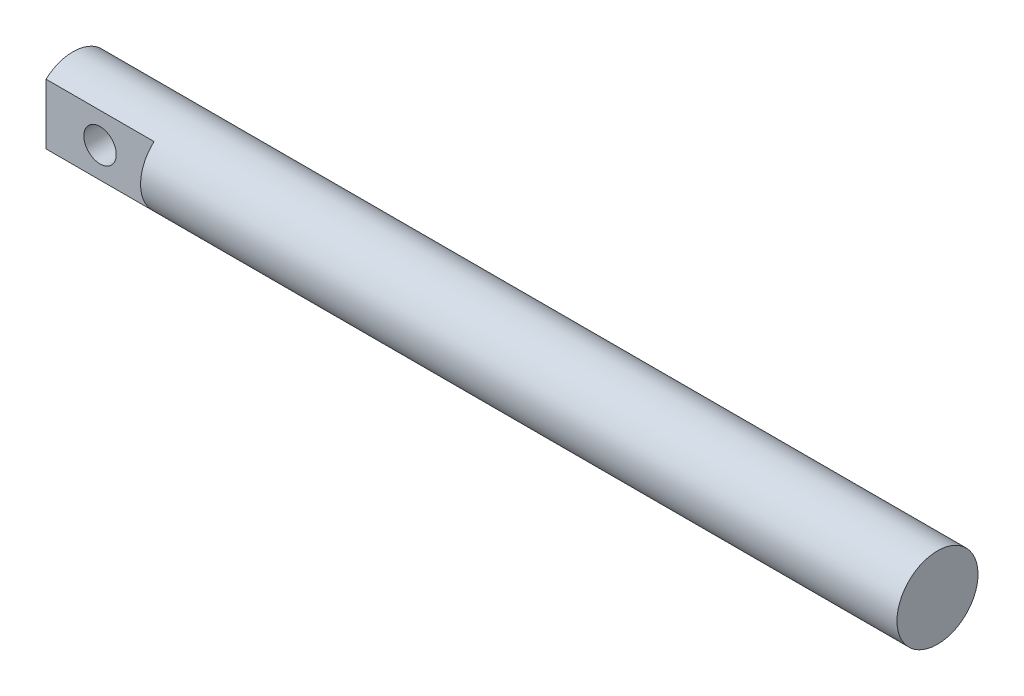
ISO-10303-21;
HEADER;
FILE_DESCRIPTION(('STEP AP214'),'2;1');
FILE_NAME('part.step','',(''),(''),'','','');
FILE_SCHEMA(('AUTOMOTIVE_DESIGN { 1 0 10303 214 1 1 1 1 }'));
ENDSEC;
DATA;
#1=APPLICATION_CONTEXT('core data for automotive mechanical design processes');
#2=APPLICATION_PROTOCOL_DEFINITION('international standard','automotive_design',2000,#1);
#3=PRODUCT_CONTEXT('',#1,'mechanical');
#4=PRODUCT('Part','Part','',(#3));
#5=PRODUCT_RELATED_PRODUCT_CATEGORY('part','',(#4));
#6=PRODUCT_DEFINITION_FORMATION('','',#4);
#7=PRODUCT_DEFINITION_CONTEXT('part definition',#1,'design');
#8=PRODUCT_DEFINITION('design','',#6,#7);
#9=PRODUCT_DEFINITION_SHAPE('','',#8);
#10=(LENGTH_UNIT() NAMED_UNIT(*) SI_UNIT(.MILLI.,.METRE.));
#11=(NAMED_UNIT(*) PLANE_ANGLE_UNIT() SI_UNIT($,.RADIAN.));
#12=(NAMED_UNIT(*) SI_UNIT($,.STERADIAN.) SOLID_ANGLE_UNIT());
#13=UNCERTAINTY_MEASURE_WITH_UNIT(LENGTH_MEASURE(1.E-05),#10,'distance_accuracy_value','');
#14=(GEOMETRIC_REPRESENTATION_CONTEXT(3) GLOBAL_UNCERTAINTY_ASSIGNED_CONTEXT((#13)) GLOBAL_UNIT_ASSIGNED_CONTEXT((#10,
#11,#12)) REPRESENTATION_CONTEXT('',''));
#15=CARTESIAN_POINT('',(0.,0.,0.));
#16=DIRECTION('',(0.,0.,1.));
#17=DIRECTION('',(1.,0.,0.));
#18=AXIS2_PLACEMENT_3D('',#15,#16,#17);
#19=CARTESIAN_POINT('',(-101.6,0.,0.));
#20=DIRECTION('',(1.,0.,0.));
#21=DIRECTION('',(0.,0.,-1.));
#22=AXIS2_PLACEMENT_3D('',#19,#20,#21);
#23=CYLINDRICAL_SURFACE('',#22,4.7625);
#24=CARTESIAN_POINT('',(0.,0.,0.));
#25=DIRECTION('',(-1.,0.,0.));
#26=DIRECTION('',(0.,0.,1.));
#27=AXIS2_PLACEMENT_3D('',#24,#25,#26);
#28=CIRCLE('',#27,4.7625);
#29=CARTESIAN_POINT('',(0.,0.,4.7625));
#30=VERTEX_POINT('',#29);
#31=EDGE_CURVE('E104',#30,#30,#28,.T.);
#32=ORIENTED_EDGE('',*,*,#31,.T.);
#33=EDGE_LOOP('',(#32));
#34=FACE_BOUND('',#33,.T.);
#35=DIRECTION('',(1.,0.,0.));
#36=VECTOR('',#35,1.);
#37=CARTESIAN_POINT('',(-101.6,3.54975791428092,-3.17499999999999));
#38=LINE('',#37,#36);
#39=CARTESIAN_POINT('',(-101.6,3.54975791428092,-3.17499999999999));
#40=VERTEX_POINT('',#39);
#41=CARTESIAN_POINT('',(-88.9,3.54975791428092,-3.17499999999999));
#42=VERTEX_POINT('',#41);
#43=EDGE_CURVE('E109',#40,#42,#38,.T.);
#44=ORIENTED_EDGE('',*,*,#43,.F.);
#45=CARTESIAN_POINT('',(-101.6,0.,0.));
#46=DIRECTION('',(-1.,0.,0.));
#47=DIRECTION('',(0.,0.,1.));
#48=AXIS2_PLACEMENT_3D('',#45,#46,#47);
#49=CIRCLE('',#48,4.7625);
#50=CARTESIAN_POINT('',(-101.6,3.54975791428091,3.17500000000001));
#51=VERTEX_POINT('',#50);
#52=EDGE_CURVE('E103',#51,#40,#49,.T.);
#53=ORIENTED_EDGE('',*,*,#52,.F.);
#54=DIRECTION('',(1.,0.,0.));
#55=VECTOR('',#54,1.);
#56=CARTESIAN_POINT('',(-101.6,3.54975791428091,3.17500000000001));
#57=LINE('',#56,#55);
#58=CARTESIAN_POINT('',(-88.9,3.54975791428091,3.17500000000001));
#59=VERTEX_POINT('',#58);
#60=EDGE_CURVE('E64',#59,#51,#57,.F.);
#61=ORIENTED_EDGE('',*,*,#60,.F.);
#62=CARTESIAN_POINT('',(-88.9,0.,0.));
#63=DIRECTION('',(1.,0.,0.));
#64=DIRECTION('',(0.,0.,-1.));
#65=AXIS2_PLACEMENT_3D('',#62,#63,#64);
#66=CIRCLE('',#65,4.7625);
#67=CARTESIAN_POINT('',(-88.9,-3.54975791428091,3.17500000000001));
#68=VERTEX_POINT('',#67);
#69=EDGE_CURVE('E49',#59,#68,#66,.T.);
#70=ORIENTED_EDGE('',*,*,#69,.T.);
#71=DIRECTION('',(1.,0.,0.));
#72=VECTOR('',#71,1.);
#73=CARTESIAN_POINT('',(-101.6,-3.54975791428091,3.17500000000001));
#74=LINE('',#73,#72);
#75=CARTESIAN_POINT('',(-101.6,-3.54975791428091,3.17500000000001));
#76=VERTEX_POINT('',#75);
#77=EDGE_CURVE('E82',#76,#68,#74,.T.);
#78=ORIENTED_EDGE('',*,*,#77,.F.);
#79=CARTESIAN_POINT('',(-101.6,-3.54975791428092,-3.17499999999999));
#80=VERTEX_POINT('',#79);
#81=EDGE_CURVE('E108',#80,#76,#49,.T.);
#82=ORIENTED_EDGE('',*,*,#81,.F.);
#83=DIRECTION('',(1.,0.,0.));
#84=VECTOR('',#83,1.);
#85=CARTESIAN_POINT('',(-101.6,-3.54975791428092,-3.17499999999999));
#86=LINE('',#85,#84);
#87=CARTESIAN_POINT('',(-88.9,-3.54975791428092,-3.17499999999999));
#88=VERTEX_POINT('',#87);
#89=EDGE_CURVE('E56',#88,#80,#86,.F.);
#90=ORIENTED_EDGE('',*,*,#89,.F.);
#91=CARTESIAN_POINT('',(-88.9,0.,0.));
#92=DIRECTION('',(1.,0.,0.));
#93=DIRECTION('',(0.,0.,-1.));
#94=AXIS2_PLACEMENT_3D('',#91,#92,#93);
#95=CIRCLE('',#94,4.7625);
#96=EDGE_CURVE('E11',#88,#42,#95,.T.);
#97=ORIENTED_EDGE('',*,*,#96,.T.);
#98=EDGE_LOOP('',(#44,#53,#61,#70,#78,#82,#90,#97));
#99=FACE_BOUND('',#98,.T.);
#100=ADVANCED_FACE('F41',(#34,#99),#23,.T.);
#101=CARTESIAN_POINT('',(-101.6,0.,0.));
#102=DIRECTION('',(-1.,0.,0.));
#103=DIRECTION('',(0.,0.,1.));
#104=AXIS2_PLACEMENT_3D('',#101,#102,#103);
#105=PLANE('',#104);
#106=ORIENTED_EDGE('',*,*,#52,.T.);
#107=DIRECTION('',(0.,-1.,0.));
#108=VECTOR('',#107,1.);
#109=CARTESIAN_POINT('',(-101.6,0.,-3.17499999999999));
#110=LINE('',#109,#108);
#111=EDGE_CURVE('E98',#40,#80,#110,.T.);
#112=ORIENTED_EDGE('',*,*,#111,.T.);
#113=ORIENTED_EDGE('',*,*,#81,.T.);
#114=DIRECTION('',(0.,1.,0.));
#115=VECTOR('',#114,1.);
#116=CARTESIAN_POINT('',(-101.6,0.,3.17500000000001));
#117=LINE('',#116,#115);
#118=EDGE_CURVE('E86',#76,#51,#117,.T.);
#119=ORIENTED_EDGE('',*,*,#118,.T.);
#120=EDGE_LOOP('',(#106,#112,#113,#119));
#121=FACE_BOUND('',#120,.T.);
#122=ADVANCED_FACE('F132',(#121),#105,.T.);
#123=CARTESIAN_POINT('',(0.,0.,0.));
#124=DIRECTION('',(-1.,0.,0.));
#125=DIRECTION('',(0.,0.,1.));
#126=AXIS2_PLACEMENT_3D('',#123,#124,#125);
#127=PLANE('',#126);
#128=ORIENTED_EDGE('',*,*,#31,.F.);
#129=EDGE_LOOP('',(#128));
#130=FACE_BOUND('',#129,.T.);
#131=ADVANCED_FACE('F134',(#130),#127,.F.);
#132=CARTESIAN_POINT('',(-104.14,-4.7625,3.17500000000001));
#133=DIRECTION('',(0.,0.,1.));
#134=DIRECTION('',(1.,0.,0.));
#135=AXIS2_PLACEMENT_3D('',#132,#133,#134);
#136=PLANE('',#135);
#137=CARTESIAN_POINT('',(-95.2500000000001,0.,3.17500000000001));
#138=DIRECTION('',(0.,0.,1.));
#139=DIRECTION('',(1.,0.,0.));
#140=AXIS2_PLACEMENT_3D('',#137,#138,#139);
#141=CIRCLE('',#140,1.90500000000005);
#142=CARTESIAN_POINT('',(-93.345,0.,3.17500000000001));
#143=VERTEX_POINT('',#142);
#144=EDGE_CURVE('E117',#143,#143,#141,.T.);
#145=ORIENTED_EDGE('',*,*,#144,.F.);
#146=EDGE_LOOP('',(#145));
#147=FACE_BOUND('',#146,.T.);
#148=ORIENTED_EDGE('',*,*,#77,.T.);
#149=DIRECTION('',(0.,1.,0.));
#150=VECTOR('',#149,1.);
#151=CARTESIAN_POINT('',(-88.9,-4.7625,3.17500000000001));
#152=LINE('',#151,#150);
#153=EDGE_CURVE('E85',#68,#59,#152,.T.);
#154=ORIENTED_EDGE('',*,*,#153,.T.);
#155=ORIENTED_EDGE('',*,*,#60,.T.);
#156=ORIENTED_EDGE('',*,*,#118,.F.);
#157=EDGE_LOOP('',(#148,#154,#155,#156));
#158=FACE_BOUND('',#157,.T.);
#159=ADVANCED_FACE('F84',(#147,#158),#136,.T.);
#160=CARTESIAN_POINT('',(-88.9,-4.7625,12.7));
#161=DIRECTION('',(1.,0.,0.));
#162=DIRECTION('',(0.,0.,-1.));
#163=AXIS2_PLACEMENT_3D('',#160,#161,#162);
#164=PLANE('',#163);
#165=ORIENTED_EDGE('',*,*,#153,.F.);
#166=ORIENTED_EDGE('',*,*,#69,.F.);
#167=EDGE_LOOP('',(#165,#166));
#168=FACE_BOUND('',#167,.T.);
#169=ADVANCED_FACE('F93',(#168),#164,.F.);
#170=CARTESIAN_POINT('',(-88.9,-4.7625,-3.17499999999999));
#171=DIRECTION('',(1.,0.,0.));
#172=DIRECTION('',(0.,0.,-1.));
#173=AXIS2_PLACEMENT_3D('',#170,#171,#172);
#174=PLANE('',#173);
#175=DIRECTION('',(0.,1.,0.));
#176=VECTOR('',#175,1.);
#177=CARTESIAN_POINT('',(-88.9,-4.7625,-3.17499999999999));
#178=LINE('',#177,#176);
#179=EDGE_CURVE('E94',#88,#42,#178,.T.);
#180=ORIENTED_EDGE('',*,*,#179,.T.);
#181=ORIENTED_EDGE('',*,*,#96,.F.);
#182=EDGE_LOOP('',(#180,#181));
#183=FACE_BOUND('',#182,.T.);
#184=ADVANCED_FACE('F128',(#183),#174,.F.);
#185=CARTESIAN_POINT('',(-88.9,-4.7625,-3.17499999999999));
#186=DIRECTION('',(0.,0.,-1.));
#187=DIRECTION('',(-1.,0.,0.));
#188=AXIS2_PLACEMENT_3D('',#185,#186,#187);
#189=PLANE('',#188);
#190=CARTESIAN_POINT('',(-95.2500000000001,0.,-3.17499999999999));
#191=DIRECTION('',(0.,0.,-1.));
#192=DIRECTION('',(-1.,0.,0.));
#193=AXIS2_PLACEMENT_3D('',#190,#191,#192);
#194=CIRCLE('',#193,1.90500000000005);
#195=CARTESIAN_POINT('',(-97.1550000000001,0.,-3.17499999999999));
#196=VERTEX_POINT('',#195);
#197=EDGE_CURVE('E44',#196,#196,#194,.T.);
#198=ORIENTED_EDGE('',*,*,#197,.F.);
#199=EDGE_LOOP('',(#198));
#200=FACE_BOUND('',#199,.T.);
#201=ORIENTED_EDGE('',*,*,#43,.T.);
#202=ORIENTED_EDGE('',*,*,#179,.F.);
#203=ORIENTED_EDGE('',*,*,#89,.T.);
#204=ORIENTED_EDGE('',*,*,#111,.F.);
#205=EDGE_LOOP('',(#201,#202,#203,#204));
#206=FACE_BOUND('',#205,.T.);
#207=ADVANCED_FACE('F126',(#200,#206),#189,.T.);
#208=CARTESIAN_POINT('',(-95.2500000000001,0.,-4.7625));
#209=DIRECTION('',(0.,0.,1.));
#210=DIRECTION('',(1.,0.,0.));
#211=AXIS2_PLACEMENT_3D('',#208,#209,#210);
#212=CYLINDRICAL_SURFACE('',#211,1.90500000000005);
#213=ORIENTED_EDGE('',*,*,#197,.T.);
#214=EDGE_LOOP('',(#213));
#215=FACE_BOUND('',#214,.T.);
#216=ORIENTED_EDGE('',*,*,#144,.T.);
#217=EDGE_LOOP('',(#216));
#218=FACE_BOUND('',#217,.T.);
#219=ADVANCED_FACE('F124',(#215,#218),#212,.F.);
#220=CLOSED_SHELL('',(#100,#122,#131,#159,#169,#184,#207,#219));
#221=MANIFOLD_SOLID_BREP('B2',#220);
#222=ADVANCED_BREP_SHAPE_REPRESENTATION('',(#18,#221),#14);
#223=SHAPE_DEFINITION_REPRESENTATION(#9,#222);
ENDSEC;
END-ISO-10303-21;
